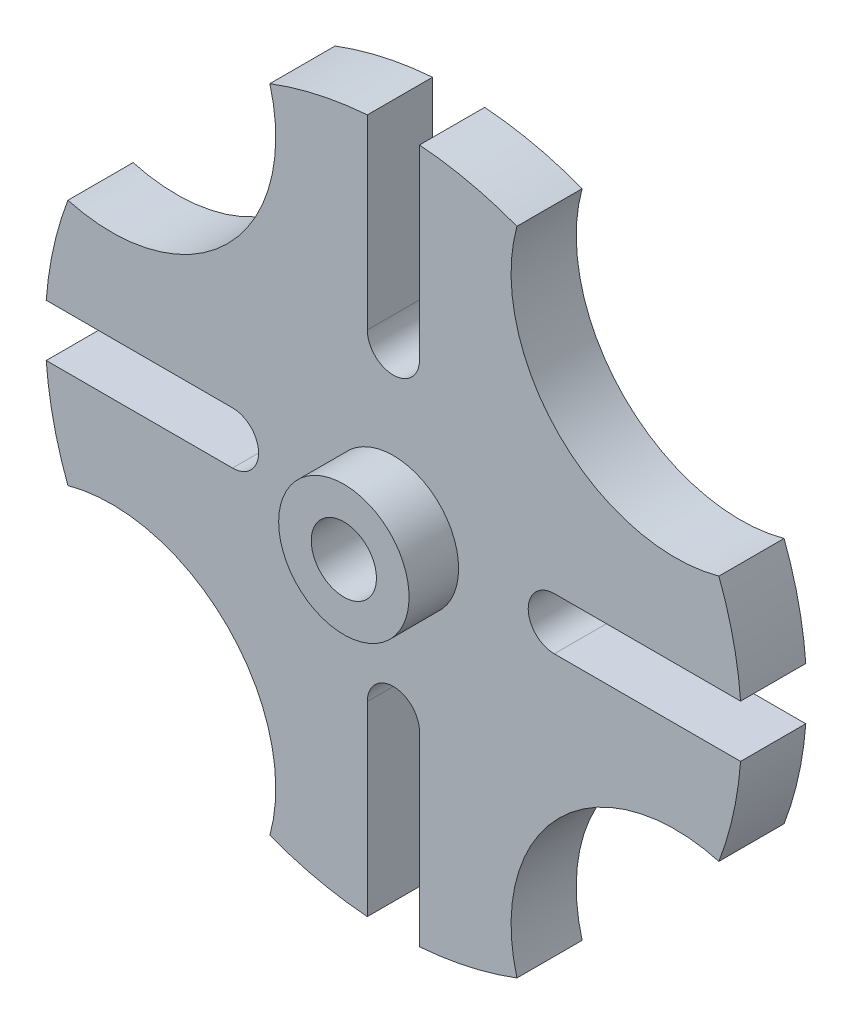
ISO-10303-21;
HEADER;
FILE_DESCRIPTION(('STEP AP214'),'2;1');
FILE_NAME('part.step','',(''),(''),'','','');
FILE_SCHEMA(('AUTOMOTIVE_DESIGN { 1 0 10303 214 1 1 1 1 }'));
ENDSEC;
DATA;
#1=APPLICATION_CONTEXT('core data for automotive mechanical design processes');
#2=APPLICATION_PROTOCOL_DEFINITION('international standard','automotive_design',2000,#1);
#3=PRODUCT_CONTEXT('',#1,'mechanical');
#4=PRODUCT('Part','Part','',(#3));
#5=PRODUCT_RELATED_PRODUCT_CATEGORY('part','',(#4));
#6=PRODUCT_DEFINITION_FORMATION('','',#4);
#7=PRODUCT_DEFINITION_CONTEXT('part definition',#1,'design');
#8=PRODUCT_DEFINITION('design','',#6,#7);
#9=PRODUCT_DEFINITION_SHAPE('','',#8);
#10=(LENGTH_UNIT() NAMED_UNIT(*) SI_UNIT(.MILLI.,.METRE.));
#11=(NAMED_UNIT(*) PLANE_ANGLE_UNIT() SI_UNIT($,.RADIAN.));
#12=(NAMED_UNIT(*) SI_UNIT($,.STERADIAN.) SOLID_ANGLE_UNIT());
#13=UNCERTAINTY_MEASURE_WITH_UNIT(LENGTH_MEASURE(1.E-05),#10,'distance_accuracy_value','');
#14=(GEOMETRIC_REPRESENTATION_CONTEXT(3) GLOBAL_UNCERTAINTY_ASSIGNED_CONTEXT((#13)) GLOBAL_UNIT_ASSIGNED_CONTEXT((#10,
#11,#12)) REPRESENTATION_CONTEXT('',''));
#15=CARTESIAN_POINT('',(0.,0.,0.));
#16=DIRECTION('',(0.,0.,1.));
#17=DIRECTION('',(1.,0.,0.));
#18=AXIS2_PLACEMENT_3D('',#15,#16,#17);
#19=CARTESIAN_POINT('',(27.4616232182294,27.4616232182295,6.35));
#20=DIRECTION('',(0.,0.,-1.));
#21=DIRECTION('',(-1.,0.,0.));
#22=AXIS2_PLACEMENT_3D('',#19,#20,#21);
#23=CYLINDRICAL_SURFACE('',#22,16.002);
#24=CARTESIAN_POINT('',(27.4616232182294,27.4616232182295,0.));
#25=DIRECTION('',(0.,0.,-1.));
#26=DIRECTION('',(1.,0.,0.));
#27=AXIS2_PLACEMENT_3D('',#24,#25,#26);
#28=CIRCLE('',#27,16.002);
#29=CARTESIAN_POINT('',(31.7026027149478,12.0318436699529,0.));
#30=VERTEX_POINT('',#29);
#31=CARTESIAN_POINT('',(12.0318436699528,31.7026027149478,0.));
#32=VERTEX_POINT('',#31);
#33=EDGE_CURVE('E238',#30,#32,#28,.T.);
#34=ORIENTED_EDGE('',*,*,#33,.T.);
#35=DIRECTION('',(0.,0.,-1.));
#36=VECTOR('',#35,1.);
#37=CARTESIAN_POINT('',(12.0318436699528,31.7026027149478,6.35));
#38=LINE('',#37,#36);
#39=CARTESIAN_POINT('',(12.0318436699528,31.7026027149478,6.35));
#40=VERTEX_POINT('',#39);
#41=EDGE_CURVE('E42',#40,#32,#38,.T.);
#42=ORIENTED_EDGE('',*,*,#41,.F.);
#43=CARTESIAN_POINT('',(27.4616232182294,27.4616232182295,6.35));
#44=DIRECTION('',(0.,0.,-1.));
#45=DIRECTION('',(1.,0.,0.));
#46=AXIS2_PLACEMENT_3D('',#43,#44,#45);
#47=CIRCLE('',#46,16.002);
#48=CARTESIAN_POINT('',(31.7026027149478,12.0318436699529,6.35));
#49=VERTEX_POINT('',#48);
#50=EDGE_CURVE('E309',#49,#40,#47,.T.);
#51=ORIENTED_EDGE('',*,*,#50,.F.);
#52=DIRECTION('',(0.,0.,-1.));
#53=VECTOR('',#52,1.);
#54=CARTESIAN_POINT('',(31.7026027149478,12.0318436699529,6.35));
#55=LINE('',#54,#53);
#56=EDGE_CURVE('E234',#49,#30,#55,.T.);
#57=ORIENTED_EDGE('',*,*,#56,.T.);
#58=EDGE_LOOP('',(#34,#42,#51,#57));
#59=FACE_BOUND('',#58,.T.);
#60=ADVANCED_FACE('F39',(#59),#23,.F.);
#61=CARTESIAN_POINT('',(0.,0.,6.35));
#62=DIRECTION('',(0.,0.,-1.));
#63=DIRECTION('',(-1.,0.,0.));
#64=AXIS2_PLACEMENT_3D('',#61,#62,#63);
#65=CYLINDRICAL_SURFACE('',#64,33.909);
#66=CARTESIAN_POINT('',(0.,0.,0.));
#67=DIRECTION('',(0.,0.,1.));
#68=DIRECTION('',(1.,0.,0.));
#69=AXIS2_PLACEMENT_3D('',#66,#67,#68);
#70=CIRCLE('',#69,33.909);
#71=CARTESIAN_POINT('',(2.53999999999999,33.8137350938934,0.));
#72=VERTEX_POINT('',#71);
#73=EDGE_CURVE('E242',#32,#72,#70,.T.);
#74=ORIENTED_EDGE('',*,*,#73,.T.);
#75=DIRECTION('',(0.,0.,-1.));
#76=VECTOR('',#75,1.);
#77=CARTESIAN_POINT('',(2.53999999999999,33.8137350938934,6.35));
#78=LINE('',#77,#76);
#79=CARTESIAN_POINT('',(2.53999999999999,33.8137350938934,6.35));
#80=VERTEX_POINT('',#79);
#81=EDGE_CURVE('E387',#80,#72,#78,.T.);
#82=ORIENTED_EDGE('',*,*,#81,.F.);
#83=CARTESIAN_POINT('',(0.,0.,6.35));
#84=DIRECTION('',(0.,0.,1.));
#85=DIRECTION('',(1.,0.,0.));
#86=AXIS2_PLACEMENT_3D('',#83,#84,#85);
#87=CIRCLE('',#86,33.909);
#88=EDGE_CURVE('E149',#40,#80,#87,.T.);
#89=ORIENTED_EDGE('',*,*,#88,.F.);
#90=ORIENTED_EDGE('',*,*,#41,.T.);
#91=EDGE_LOOP('',(#74,#82,#89,#90));
#92=FACE_BOUND('',#91,.T.);
#93=ADVANCED_FACE('F395',(#92),#65,.T.);
#94=CARTESIAN_POINT('',(2.54,15.6704826026514,6.35));
#95=DIRECTION('',(1.,0.,0.));
#96=DIRECTION('',(0.,1.,0.));
#97=AXIS2_PLACEMENT_3D('',#94,#95,#96);
#98=PLANE('',#97);
#99=DIRECTION('',(0.,-1.,0.));
#100=VECTOR('',#99,1.);
#101=CARTESIAN_POINT('',(2.54,15.6704826026514,0.));
#102=LINE('',#101,#100);
#103=CARTESIAN_POINT('',(2.54000000000001,15.6704826026514,0.));
#104=VERTEX_POINT('',#103);
#105=EDGE_CURVE('E246',#72,#104,#102,.T.);
#106=ORIENTED_EDGE('',*,*,#105,.T.);
#107=DIRECTION('',(0.,0.,-1.));
#108=VECTOR('',#107,1.);
#109=CARTESIAN_POINT('',(2.54000000000001,15.6704826026514,6.35));
#110=LINE('',#109,#108);
#111=CARTESIAN_POINT('',(2.54000000000001,15.6704826026514,6.35));
#112=VERTEX_POINT('',#111);
#113=EDGE_CURVE('E384',#112,#104,#110,.T.);
#114=ORIENTED_EDGE('',*,*,#113,.F.);
#115=DIRECTION('',(0.,-1.,0.));
#116=VECTOR('',#115,1.);
#117=CARTESIAN_POINT('',(2.54,15.6704826026514,6.35));
#118=LINE('',#117,#116);
#119=EDGE_CURVE('E413',#80,#112,#118,.T.);
#120=ORIENTED_EDGE('',*,*,#119,.F.);
#121=ORIENTED_EDGE('',*,*,#81,.T.);
#122=EDGE_LOOP('',(#106,#114,#120,#121));
#123=FACE_BOUND('',#122,.T.);
#124=ADVANCED_FACE('F404',(#123),#98,.F.);
#125=CARTESIAN_POINT('',(0.,15.6704826026514,6.35));
#126=DIRECTION('',(0.,0.,-1.));
#127=DIRECTION('',(-1.,0.,0.));
#128=AXIS2_PLACEMENT_3D('',#125,#126,#127);
#129=CYLINDRICAL_SURFACE('',#128,2.54);
#130=CARTESIAN_POINT('',(0.,15.6704826026514,0.));
#131=DIRECTION('',(0.,0.,-1.));
#132=DIRECTION('',(1.,0.,0.));
#133=AXIS2_PLACEMENT_3D('',#130,#131,#132);
#134=CIRCLE('',#133,2.54);
#135=CARTESIAN_POINT('',(-2.54,15.6704826026514,0.));
#136=VERTEX_POINT('',#135);
#137=EDGE_CURVE('E249',#104,#136,#134,.T.);
#138=ORIENTED_EDGE('',*,*,#137,.T.);
#139=DIRECTION('',(0.,0.,-1.));
#140=VECTOR('',#139,1.);
#141=CARTESIAN_POINT('',(-2.54,15.6704826026514,6.35));
#142=LINE('',#141,#140);
#143=CARTESIAN_POINT('',(-2.54,15.6704826026514,6.35));
#144=VERTEX_POINT('',#143);
#145=EDGE_CURVE('E380',#144,#136,#142,.T.);
#146=ORIENTED_EDGE('',*,*,#145,.F.);
#147=CARTESIAN_POINT('',(0.,15.6704826026514,6.35));
#148=DIRECTION('',(0.,0.,-1.));
#149=DIRECTION('',(1.,0.,0.));
#150=AXIS2_PLACEMENT_3D('',#147,#148,#149);
#151=CIRCLE('',#150,2.54);
#152=EDGE_CURVE('E409',#112,#144,#151,.T.);
#153=ORIENTED_EDGE('',*,*,#152,.F.);
#154=ORIENTED_EDGE('',*,*,#113,.T.);
#155=EDGE_LOOP('',(#138,#146,#153,#154));
#156=FACE_BOUND('',#155,.T.);
#157=ADVANCED_FACE('F407',(#156),#129,.F.);
#158=CARTESIAN_POINT('',(-2.54,15.6704826026514,6.35));
#159=DIRECTION('',(-1.,0.,0.));
#160=DIRECTION('',(0.,-1.,0.));
#161=AXIS2_PLACEMENT_3D('',#158,#159,#160);
#162=PLANE('',#161);
#163=DIRECTION('',(0.,1.,0.));
#164=VECTOR('',#163,1.);
#165=CARTESIAN_POINT('',(-2.54,15.6704826026514,0.));
#166=LINE('',#165,#164);
#167=CARTESIAN_POINT('',(-2.54000000000001,33.8137350938934,0.));
#168=VERTEX_POINT('',#167);
#169=EDGE_CURVE('E252',#136,#168,#166,.T.);
#170=ORIENTED_EDGE('',*,*,#169,.T.);
#171=DIRECTION('',(0.,0.,-1.));
#172=VECTOR('',#171,1.);
#173=CARTESIAN_POINT('',(-2.54000000000001,33.8137350938934,6.35));
#174=LINE('',#173,#172);
#175=CARTESIAN_POINT('',(-2.54000000000001,33.8137350938934,6.35));
#176=VERTEX_POINT('',#175);
#177=EDGE_CURVE('E376',#176,#168,#174,.T.);
#178=ORIENTED_EDGE('',*,*,#177,.F.);
#179=DIRECTION('',(0.,1.,0.));
#180=VECTOR('',#179,1.);
#181=CARTESIAN_POINT('',(-2.54,15.6704826026514,6.35));
#182=LINE('',#181,#180);
#183=EDGE_CURVE('E412',#144,#176,#182,.T.);
#184=ORIENTED_EDGE('',*,*,#183,.F.);
#185=ORIENTED_EDGE('',*,*,#145,.T.);
#186=EDGE_LOOP('',(#170,#178,#184,#185));
#187=FACE_BOUND('',#186,.T.);
#188=ADVANCED_FACE('F546',(#187),#162,.F.);
#189=CARTESIAN_POINT('',(0.,0.,6.35));
#190=DIRECTION('',(0.,0.,-1.));
#191=DIRECTION('',(-1.,0.,0.));
#192=AXIS2_PLACEMENT_3D('',#189,#190,#191);
#193=CYLINDRICAL_SURFACE('',#192,33.909);
#194=CARTESIAN_POINT('',(0.,0.,0.));
#195=DIRECTION('',(0.,0.,1.));
#196=DIRECTION('',(1.,0.,0.));
#197=AXIS2_PLACEMENT_3D('',#194,#195,#196);
#198=CIRCLE('',#197,33.909);
#199=CARTESIAN_POINT('',(-12.0318436699529,31.7026027149478,0.));
#200=VERTEX_POINT('',#199);
#201=EDGE_CURVE('E255',#168,#200,#198,.T.);
#202=ORIENTED_EDGE('',*,*,#201,.T.);
#203=DIRECTION('',(0.,0.,-1.));
#204=VECTOR('',#203,1.);
#205=CARTESIAN_POINT('',(-12.0318436699529,31.7026027149478,6.35));
#206=LINE('',#205,#204);
#207=CARTESIAN_POINT('',(-12.0318436699529,31.7026027149478,6.35));
#208=VERTEX_POINT('',#207);
#209=EDGE_CURVE('E372',#208,#200,#206,.T.);
#210=ORIENTED_EDGE('',*,*,#209,.F.);
#211=CARTESIAN_POINT('',(0.,0.,6.35));
#212=DIRECTION('',(0.,0.,1.));
#213=DIRECTION('',(1.,0.,0.));
#214=AXIS2_PLACEMENT_3D('',#211,#212,#213);
#215=CIRCLE('',#214,33.909);
#216=EDGE_CURVE('E417',#176,#208,#215,.T.);
#217=ORIENTED_EDGE('',*,*,#216,.F.);
#218=ORIENTED_EDGE('',*,*,#177,.T.);
#219=EDGE_LOOP('',(#202,#210,#217,#218));
#220=FACE_BOUND('',#219,.T.);
#221=ADVANCED_FACE('F543',(#220),#193,.T.);
#222=CARTESIAN_POINT('',(-27.4616232182295,27.4616232182294,6.35));
#223=DIRECTION('',(0.,0.,-1.));
#224=DIRECTION('',(-1.,0.,0.));
#225=AXIS2_PLACEMENT_3D('',#222,#223,#224);
#226=CYLINDRICAL_SURFACE('',#225,16.002);
#227=CARTESIAN_POINT('',(-27.4616232182295,27.4616232182294,0.));
#228=DIRECTION('',(0.,0.,-1.));
#229=DIRECTION('',(1.,0.,0.));
#230=AXIS2_PLACEMENT_3D('',#227,#228,#229);
#231=CIRCLE('',#230,16.002);
#232=CARTESIAN_POINT('',(-31.7026027149478,12.0318436699528,0.));
#233=VERTEX_POINT('',#232);
#234=EDGE_CURVE('E258',#200,#233,#231,.T.);
#235=ORIENTED_EDGE('',*,*,#234,.T.);
#236=DIRECTION('',(0.,0.,-1.));
#237=VECTOR('',#236,1.);
#238=CARTESIAN_POINT('',(-31.7026027149478,12.0318436699528,6.35));
#239=LINE('',#238,#237);
#240=CARTESIAN_POINT('',(-31.7026027149478,12.0318436699528,6.35));
#241=VERTEX_POINT('',#240);
#242=EDGE_CURVE('E368',#241,#233,#239,.T.);
#243=ORIENTED_EDGE('',*,*,#242,.F.);
#244=CARTESIAN_POINT('',(-27.4616232182295,27.4616232182294,6.35));
#245=DIRECTION('',(0.,0.,-1.));
#246=DIRECTION('',(1.,0.,0.));
#247=AXIS2_PLACEMENT_3D('',#244,#245,#246);
#248=CIRCLE('',#247,16.002);
#249=EDGE_CURVE('E424',#208,#241,#248,.T.);
#250=ORIENTED_EDGE('',*,*,#249,.F.);
#251=ORIENTED_EDGE('',*,*,#209,.T.);
#252=EDGE_LOOP('',(#235,#243,#250,#251));
#253=FACE_BOUND('',#252,.T.);
#254=ADVANCED_FACE('F538',(#253),#226,.F.);
#255=CARTESIAN_POINT('',(0.,0.,6.35));
#256=DIRECTION('',(0.,0.,-1.));
#257=DIRECTION('',(-1.,0.,0.));
#258=AXIS2_PLACEMENT_3D('',#255,#256,#257);
#259=CYLINDRICAL_SURFACE('',#258,33.909);
#260=CARTESIAN_POINT('',(0.,0.,0.));
#261=DIRECTION('',(0.,0.,1.));
#262=DIRECTION('',(1.,0.,0.));
#263=AXIS2_PLACEMENT_3D('',#260,#261,#262);
#264=CIRCLE('',#263,33.909);
#265=CARTESIAN_POINT('',(-33.8137350938934,2.54,0.));
#266=VERTEX_POINT('',#265);
#267=EDGE_CURVE('E261',#233,#266,#264,.T.);
#268=ORIENTED_EDGE('',*,*,#267,.T.);
#269=DIRECTION('',(0.,0.,-1.));
#270=VECTOR('',#269,1.);
#271=CARTESIAN_POINT('',(-33.8137350938934,2.54,6.35));
#272=LINE('',#271,#270);
#273=CARTESIAN_POINT('',(-33.8137350938934,2.54,6.35));
#274=VERTEX_POINT('',#273);
#275=EDGE_CURVE('E364',#274,#266,#272,.T.);
#276=ORIENTED_EDGE('',*,*,#275,.F.);
#277=CARTESIAN_POINT('',(0.,0.,6.35));
#278=DIRECTION('',(0.,0.,1.));
#279=DIRECTION('',(1.,0.,0.));
#280=AXIS2_PLACEMENT_3D('',#277,#278,#279);
#281=CIRCLE('',#280,33.909);
#282=EDGE_CURVE('E427',#241,#274,#281,.T.);
#283=ORIENTED_EDGE('',*,*,#282,.F.);
#284=ORIENTED_EDGE('',*,*,#242,.T.);
#285=EDGE_LOOP('',(#268,#276,#283,#284));
#286=FACE_BOUND('',#285,.T.);
#287=ADVANCED_FACE('F533',(#286),#259,.T.);
#288=CARTESIAN_POINT('',(-15.6704826026514,2.54000000000001,6.35));
#289=DIRECTION('',(0.,1.,0.));
#290=DIRECTION('',(-1.,0.,0.));
#291=AXIS2_PLACEMENT_3D('',#288,#289,#290);
#292=PLANE('',#291);
#293=DIRECTION('',(1.,0.,0.));
#294=VECTOR('',#293,1.);
#295=CARTESIAN_POINT('',(-15.6704826026514,2.54000000000001,0.));
#296=LINE('',#295,#294);
#297=CARTESIAN_POINT('',(-15.6704826026514,2.54,0.));
#298=VERTEX_POINT('',#297);
#299=EDGE_CURVE('E264',#266,#298,#296,.T.);
#300=ORIENTED_EDGE('',*,*,#299,.T.);
#301=DIRECTION('',(0.,0.,-1.));
#302=VECTOR('',#301,1.);
#303=CARTESIAN_POINT('',(-15.6704826026514,2.54,6.35));
#304=LINE('',#303,#302);
#305=CARTESIAN_POINT('',(-15.6704826026514,2.54,6.35));
#306=VERTEX_POINT('',#305);
#307=EDGE_CURVE('E360',#306,#298,#304,.T.);
#308=ORIENTED_EDGE('',*,*,#307,.F.);
#309=DIRECTION('',(1.,0.,0.));
#310=VECTOR('',#309,1.);
#311=CARTESIAN_POINT('',(-15.6704826026514,2.54000000000001,6.35));
#312=LINE('',#311,#310);
#313=EDGE_CURVE('E430',#274,#306,#312,.T.);
#314=ORIENTED_EDGE('',*,*,#313,.F.);
#315=ORIENTED_EDGE('',*,*,#275,.T.);
#316=EDGE_LOOP('',(#300,#308,#314,#315));
#317=FACE_BOUND('',#316,.T.);
#318=ADVANCED_FACE('F529',(#317),#292,.F.);
#319=CARTESIAN_POINT('',(-15.6704826026514,0.,6.35));
#320=DIRECTION('',(0.,0.,-1.));
#321=DIRECTION('',(-1.,0.,0.));
#322=AXIS2_PLACEMENT_3D('',#319,#320,#321);
#323=CYLINDRICAL_SURFACE('',#322,2.54);
#324=CARTESIAN_POINT('',(-15.6704826026514,0.,0.));
#325=DIRECTION('',(0.,0.,-1.));
#326=DIRECTION('',(1.,0.,0.));
#327=AXIS2_PLACEMENT_3D('',#324,#325,#326);
#328=CIRCLE('',#327,2.54);
#329=CARTESIAN_POINT('',(-15.6704826026514,-2.53999999999999,0.));
#330=VERTEX_POINT('',#329);
#331=EDGE_CURVE('E267',#298,#330,#328,.T.);
#332=ORIENTED_EDGE('',*,*,#331,.T.);
#333=DIRECTION('',(0.,0.,-1.));
#334=VECTOR('',#333,1.);
#335=CARTESIAN_POINT('',(-15.6704826026514,-2.53999999999999,6.35));
#336=LINE('',#335,#334);
#337=CARTESIAN_POINT('',(-15.6704826026514,-2.53999999999999,6.35));
#338=VERTEX_POINT('',#337);
#339=EDGE_CURVE('E356',#338,#330,#336,.T.);
#340=ORIENTED_EDGE('',*,*,#339,.F.);
#341=CARTESIAN_POINT('',(-15.6704826026514,0.,6.35));
#342=DIRECTION('',(0.,0.,-1.));
#343=DIRECTION('',(1.,0.,0.));
#344=AXIS2_PLACEMENT_3D('',#341,#342,#343);
#345=CIRCLE('',#344,2.54);
#346=EDGE_CURVE('E433',#306,#338,#345,.T.);
#347=ORIENTED_EDGE('',*,*,#346,.F.);
#348=ORIENTED_EDGE('',*,*,#307,.T.);
#349=EDGE_LOOP('',(#332,#340,#347,#348));
#350=FACE_BOUND('',#349,.T.);
#351=ADVANCED_FACE('F524',(#350),#323,.F.);
#352=CARTESIAN_POINT('',(-15.6704826026514,-2.53999999999999,6.35));
#353=DIRECTION('',(0.,-1.,0.));
#354=DIRECTION('',(1.,0.,0.));
#355=AXIS2_PLACEMENT_3D('',#352,#353,#354);
#356=PLANE('',#355);
#357=DIRECTION('',(-1.,0.,0.));
#358=VECTOR('',#357,1.);
#359=CARTESIAN_POINT('',(-15.6704826026514,-2.53999999999999,0.));
#360=LINE('',#359,#358);
#361=CARTESIAN_POINT('',(-33.8137350938934,-2.54,0.));
#362=VERTEX_POINT('',#361);
#363=EDGE_CURVE('E270',#330,#362,#360,.T.);
#364=ORIENTED_EDGE('',*,*,#363,.T.);
#365=DIRECTION('',(0.,0.,-1.));
#366=VECTOR('',#365,1.);
#367=CARTESIAN_POINT('',(-33.8137350938934,-2.54,6.35));
#368=LINE('',#367,#366);
#369=CARTESIAN_POINT('',(-33.8137350938934,-2.54,6.35));
#370=VERTEX_POINT('',#369);
#371=EDGE_CURVE('E352',#370,#362,#368,.T.);
#372=ORIENTED_EDGE('',*,*,#371,.F.);
#373=DIRECTION('',(-1.,0.,0.));
#374=VECTOR('',#373,1.);
#375=CARTESIAN_POINT('',(-15.6704826026514,-2.53999999999999,6.35));
#376=LINE('',#375,#374);
#377=EDGE_CURVE('E436',#338,#370,#376,.T.);
#378=ORIENTED_EDGE('',*,*,#377,.F.);
#379=ORIENTED_EDGE('',*,*,#339,.T.);
#380=EDGE_LOOP('',(#364,#372,#378,#379));
#381=FACE_BOUND('',#380,.T.);
#382=ADVANCED_FACE('F518',(#381),#356,.F.);
#383=CARTESIAN_POINT('',(0.,0.,6.35));
#384=DIRECTION('',(0.,0.,-1.));
#385=DIRECTION('',(-1.,0.,0.));
#386=AXIS2_PLACEMENT_3D('',#383,#384,#385);
#387=CYLINDRICAL_SURFACE('',#386,33.909);
#388=CARTESIAN_POINT('',(0.,0.,0.));
#389=DIRECTION('',(0.,0.,1.));
#390=DIRECTION('',(1.,0.,0.));
#391=AXIS2_PLACEMENT_3D('',#388,#389,#390);
#392=CIRCLE('',#391,33.909);
#393=CARTESIAN_POINT('',(-31.7026027149478,-12.0318436699529,0.));
#394=VERTEX_POINT('',#393);
#395=EDGE_CURVE('E273',#362,#394,#392,.T.);
#396=ORIENTED_EDGE('',*,*,#395,.T.);
#397=DIRECTION('',(0.,0.,-1.));
#398=VECTOR('',#397,1.);
#399=CARTESIAN_POINT('',(-31.7026027149478,-12.0318436699529,6.35));
#400=LINE('',#399,#398);
#401=CARTESIAN_POINT('',(-31.7026027149478,-12.0318436699529,6.35));
#402=VERTEX_POINT('',#401);
#403=EDGE_CURVE('E348',#402,#394,#400,.T.);
#404=ORIENTED_EDGE('',*,*,#403,.F.);
#405=CARTESIAN_POINT('',(0.,0.,6.35));
#406=DIRECTION('',(0.,0.,1.));
#407=DIRECTION('',(1.,0.,0.));
#408=AXIS2_PLACEMENT_3D('',#405,#406,#407);
#409=CIRCLE('',#408,33.909);
#410=EDGE_CURVE('E439',#370,#402,#409,.T.);
#411=ORIENTED_EDGE('',*,*,#410,.F.);
#412=ORIENTED_EDGE('',*,*,#371,.T.);
#413=EDGE_LOOP('',(#396,#404,#411,#412));
#414=FACE_BOUND('',#413,.T.);
#415=ADVANCED_FACE('F514',(#414),#387,.T.);
#416=CARTESIAN_POINT('',(-27.4616232182294,-27.4616232182295,6.35));
#417=DIRECTION('',(0.,0.,-1.));
#418=DIRECTION('',(-1.,0.,0.));
#419=AXIS2_PLACEMENT_3D('',#416,#417,#418);
#420=CYLINDRICAL_SURFACE('',#419,16.002);
#421=CARTESIAN_POINT('',(-27.4616232182294,-27.4616232182295,0.));
#422=DIRECTION('',(0.,0.,-1.));
#423=DIRECTION('',(1.,0.,0.));
#424=AXIS2_PLACEMENT_3D('',#421,#422,#423);
#425=CIRCLE('',#424,16.002);
#426=CARTESIAN_POINT('',(-12.0318436699528,-31.7026027149478,0.));
#427=VERTEX_POINT('',#426);
#428=EDGE_CURVE('E276',#394,#427,#425,.T.);
#429=ORIENTED_EDGE('',*,*,#428,.T.);
#430=DIRECTION('',(0.,0.,-1.));
#431=VECTOR('',#430,1.);
#432=CARTESIAN_POINT('',(-12.0318436699528,-31.7026027149478,6.35));
#433=LINE('',#432,#431);
#434=CARTESIAN_POINT('',(-12.0318436699528,-31.7026027149478,6.35));
#435=VERTEX_POINT('',#434);
#436=EDGE_CURVE('E344',#435,#427,#433,.T.);
#437=ORIENTED_EDGE('',*,*,#436,.F.);
#438=CARTESIAN_POINT('',(-27.4616232182294,-27.4616232182295,6.35));
#439=DIRECTION('',(0.,0.,-1.));
#440=DIRECTION('',(1.,0.,0.));
#441=AXIS2_PLACEMENT_3D('',#438,#439,#440);
#442=CIRCLE('',#441,16.002);
#443=EDGE_CURVE('E442',#402,#435,#442,.T.);
#444=ORIENTED_EDGE('',*,*,#443,.F.);
#445=ORIENTED_EDGE('',*,*,#403,.T.);
#446=EDGE_LOOP('',(#429,#437,#444,#445));
#447=FACE_BOUND('',#446,.T.);
#448=ADVANCED_FACE('F509',(#447),#420,.F.);
#449=CARTESIAN_POINT('',(0.,0.,6.35));
#450=DIRECTION('',(0.,0.,-1.));
#451=DIRECTION('',(-1.,0.,0.));
#452=AXIS2_PLACEMENT_3D('',#449,#450,#451);
#453=CYLINDRICAL_SURFACE('',#452,33.909);
#454=CARTESIAN_POINT('',(0.,0.,0.));
#455=DIRECTION('',(0.,0.,1.));
#456=DIRECTION('',(1.,0.,0.));
#457=AXIS2_PLACEMENT_3D('',#454,#455,#456);
#458=CIRCLE('',#457,33.909);
#459=CARTESIAN_POINT('',(-2.54,-33.8137350938934,0.));
#460=VERTEX_POINT('',#459);
#461=EDGE_CURVE('E279',#427,#460,#458,.T.);
#462=ORIENTED_EDGE('',*,*,#461,.T.);
#463=DIRECTION('',(0.,0.,-1.));
#464=VECTOR('',#463,1.);
#465=CARTESIAN_POINT('',(-2.54,-33.8137350938934,6.35));
#466=LINE('',#465,#464);
#467=CARTESIAN_POINT('',(-2.54,-33.8137350938934,6.35));
#468=VERTEX_POINT('',#467);
#469=EDGE_CURVE('E340',#468,#460,#466,.T.);
#470=ORIENTED_EDGE('',*,*,#469,.F.);
#471=CARTESIAN_POINT('',(0.,0.,6.35));
#472=DIRECTION('',(0.,0.,1.));
#473=DIRECTION('',(1.,0.,0.));
#474=AXIS2_PLACEMENT_3D('',#471,#472,#473);
#475=CIRCLE('',#474,33.909);
#476=EDGE_CURVE('E445',#435,#468,#475,.T.);
#477=ORIENTED_EDGE('',*,*,#476,.F.);
#478=ORIENTED_EDGE('',*,*,#436,.T.);
#479=EDGE_LOOP('',(#462,#470,#477,#478));
#480=FACE_BOUND('',#479,.T.);
#481=ADVANCED_FACE('F503',(#480),#453,.T.);
#482=CARTESIAN_POINT('',(-2.54,-15.6704826026514,6.35));
#483=DIRECTION('',(-1.,0.,0.));
#484=DIRECTION('',(0.,-1.,0.));
#485=AXIS2_PLACEMENT_3D('',#482,#483,#484);
#486=PLANE('',#485);
#487=DIRECTION('',(0.,1.,0.));
#488=VECTOR('',#487,1.);
#489=CARTESIAN_POINT('',(-2.54,-15.6704826026514,0.));
#490=LINE('',#489,#488);
#491=CARTESIAN_POINT('',(-2.54000000000001,-15.6704826026514,0.));
#492=VERTEX_POINT('',#491);
#493=EDGE_CURVE('E282',#460,#492,#490,.T.);
#494=ORIENTED_EDGE('',*,*,#493,.T.);
#495=DIRECTION('',(0.,0.,-1.));
#496=VECTOR('',#495,1.);
#497=CARTESIAN_POINT('',(-2.54000000000001,-15.6704826026514,6.35));
#498=LINE('',#497,#496);
#499=CARTESIAN_POINT('',(-2.54000000000001,-15.6704826026514,6.35));
#500=VERTEX_POINT('',#499);
#501=EDGE_CURVE('E336',#500,#492,#498,.T.);
#502=ORIENTED_EDGE('',*,*,#501,.F.);
#503=DIRECTION('',(0.,1.,0.));
#504=VECTOR('',#503,1.);
#505=CARTESIAN_POINT('',(-2.54,-15.6704826026514,6.35));
#506=LINE('',#505,#504);
#507=EDGE_CURVE('E448',#468,#500,#506,.T.);
#508=ORIENTED_EDGE('',*,*,#507,.F.);
#509=ORIENTED_EDGE('',*,*,#469,.T.);
#510=EDGE_LOOP('',(#494,#502,#508,#509));
#511=FACE_BOUND('',#510,.T.);
#512=ADVANCED_FACE('F499',(#511),#486,.F.);
#513=CARTESIAN_POINT('',(0.,-15.6704826026514,6.35));
#514=DIRECTION('',(0.,0.,-1.));
#515=DIRECTION('',(-1.,0.,0.));
#516=AXIS2_PLACEMENT_3D('',#513,#514,#515);
#517=CYLINDRICAL_SURFACE('',#516,2.54000000000001);
#518=CARTESIAN_POINT('',(0.,-15.6704826026514,0.));
#519=DIRECTION('',(0.,0.,-1.));
#520=DIRECTION('',(1.,0.,0.));
#521=AXIS2_PLACEMENT_3D('',#518,#519,#520);
#522=CIRCLE('',#521,2.54000000000001);
#523=CARTESIAN_POINT('',(2.54000000000001,-15.6704826026514,0.));
#524=VERTEX_POINT('',#523);
#525=EDGE_CURVE('E285',#492,#524,#522,.T.);
#526=ORIENTED_EDGE('',*,*,#525,.T.);
#527=DIRECTION('',(0.,0.,-1.));
#528=VECTOR('',#527,1.);
#529=CARTESIAN_POINT('',(2.54000000000001,-15.6704826026514,6.35));
#530=LINE('',#529,#528);
#531=CARTESIAN_POINT('',(2.54000000000001,-15.6704826026514,6.35));
#532=VERTEX_POINT('',#531);
#533=EDGE_CURVE('E332',#532,#524,#530,.T.);
#534=ORIENTED_EDGE('',*,*,#533,.F.);
#535=CARTESIAN_POINT('',(0.,-15.6704826026514,6.35));
#536=DIRECTION('',(0.,0.,-1.));
#537=DIRECTION('',(1.,0.,0.));
#538=AXIS2_PLACEMENT_3D('',#535,#536,#537);
#539=CIRCLE('',#538,2.54000000000001);
#540=EDGE_CURVE('E451',#500,#532,#539,.T.);
#541=ORIENTED_EDGE('',*,*,#540,.F.);
#542=ORIENTED_EDGE('',*,*,#501,.T.);
#543=EDGE_LOOP('',(#526,#534,#541,#542));
#544=FACE_BOUND('',#543,.T.);
#545=ADVANCED_FACE('F494',(#544),#517,.F.);
#546=CARTESIAN_POINT('',(2.54000000000001,-15.6704826026514,6.35));
#547=DIRECTION('',(1.,0.,0.));
#548=DIRECTION('',(0.,1.,0.));
#549=AXIS2_PLACEMENT_3D('',#546,#547,#548);
#550=PLANE('',#549);
#551=DIRECTION('',(0.,-1.,0.));
#552=VECTOR('',#551,1.);
#553=CARTESIAN_POINT('',(2.54000000000001,-15.6704826026514,0.));
#554=LINE('',#553,#552);
#555=CARTESIAN_POINT('',(2.54,-33.8137350938934,0.));
#556=VERTEX_POINT('',#555);
#557=EDGE_CURVE('E288',#524,#556,#554,.T.);
#558=ORIENTED_EDGE('',*,*,#557,.T.);
#559=DIRECTION('',(0.,0.,-1.));
#560=VECTOR('',#559,1.);
#561=CARTESIAN_POINT('',(2.54,-33.8137350938934,6.35));
#562=LINE('',#561,#560);
#563=CARTESIAN_POINT('',(2.54,-33.8137350938934,6.35));
#564=VERTEX_POINT('',#563);
#565=EDGE_CURVE('E328',#564,#556,#562,.T.);
#566=ORIENTED_EDGE('',*,*,#565,.F.);
#567=DIRECTION('',(0.,-1.,0.));
#568=VECTOR('',#567,1.);
#569=CARTESIAN_POINT('',(2.54000000000001,-15.6704826026514,6.35));
#570=LINE('',#569,#568);
#571=EDGE_CURVE('E454',#532,#564,#570,.T.);
#572=ORIENTED_EDGE('',*,*,#571,.F.);
#573=ORIENTED_EDGE('',*,*,#533,.T.);
#574=EDGE_LOOP('',(#558,#566,#572,#573));
#575=FACE_BOUND('',#574,.T.);
#576=ADVANCED_FACE('F488',(#575),#550,.F.);
#577=CARTESIAN_POINT('',(0.,0.,6.35));
#578=DIRECTION('',(0.,0.,-1.));
#579=DIRECTION('',(-1.,0.,0.));
#580=AXIS2_PLACEMENT_3D('',#577,#578,#579);
#581=CYLINDRICAL_SURFACE('',#580,33.909);
#582=CARTESIAN_POINT('',(0.,0.,0.));
#583=DIRECTION('',(0.,0.,1.));
#584=DIRECTION('',(1.,0.,0.));
#585=AXIS2_PLACEMENT_3D('',#582,#583,#584);
#586=CIRCLE('',#585,33.909);
#587=CARTESIAN_POINT('',(12.0318436699532,-31.7026027149477,0.));
#588=VERTEX_POINT('',#587);
#589=EDGE_CURVE('E291',#556,#588,#586,.T.);
#590=ORIENTED_EDGE('',*,*,#589,.T.);
#591=DIRECTION('',(0.,0.,-1.));
#592=VECTOR('',#591,1.);
#593=CARTESIAN_POINT('',(12.0318436699532,-31.7026027149477,6.35));
#594=LINE('',#593,#592);
#595=CARTESIAN_POINT('',(12.0318436699532,-31.7026027149477,6.35));
#596=VERTEX_POINT('',#595);
#597=EDGE_CURVE('E324',#596,#588,#594,.T.);
#598=ORIENTED_EDGE('',*,*,#597,.F.);
#599=CARTESIAN_POINT('',(0.,0.,6.35));
#600=DIRECTION('',(0.,0.,1.));
#601=DIRECTION('',(1.,0.,0.));
#602=AXIS2_PLACEMENT_3D('',#599,#600,#601);
#603=CIRCLE('',#602,33.909);
#604=EDGE_CURVE('E457',#564,#596,#603,.T.);
#605=ORIENTED_EDGE('',*,*,#604,.F.);
#606=ORIENTED_EDGE('',*,*,#565,.T.);
#607=EDGE_LOOP('',(#590,#598,#605,#606));
#608=FACE_BOUND('',#607,.T.);
#609=ADVANCED_FACE('F484',(#608),#581,.T.);
#610=CARTESIAN_POINT('',(27.4616232182302,-27.46162321823,6.35));
#611=DIRECTION('',(0.,0.,-1.));
#612=DIRECTION('',(-1.,0.,0.));
#613=AXIS2_PLACEMENT_3D('',#610,#611,#612);
#614=CYLINDRICAL_SURFACE('',#613,16.0020000000003);
#615=CARTESIAN_POINT('',(27.4616232182302,-27.46162321823,0.));
#616=DIRECTION('',(0.,0.,-1.));
#617=DIRECTION('',(1.,0.,0.));
#618=AXIS2_PLACEMENT_3D('',#615,#616,#617);
#619=CIRCLE('',#618,16.0020000000003);
#620=CARTESIAN_POINT('',(31.7026027149482,-12.0318436699532,0.));
#621=VERTEX_POINT('',#620);
#622=EDGE_CURVE('E294',#588,#621,#619,.T.);
#623=ORIENTED_EDGE('',*,*,#622,.T.);
#624=DIRECTION('',(0.,0.,-1.));
#625=VECTOR('',#624,1.);
#626=CARTESIAN_POINT('',(31.7026027149482,-12.0318436699532,6.35));
#627=LINE('',#626,#625);
#628=CARTESIAN_POINT('',(31.7026027149482,-12.0318436699532,6.35));
#629=VERTEX_POINT('',#628);
#630=EDGE_CURVE('E320',#629,#621,#627,.T.);
#631=ORIENTED_EDGE('',*,*,#630,.F.);
#632=CARTESIAN_POINT('',(27.4616232182302,-27.46162321823,6.35));
#633=DIRECTION('',(0.,0.,-1.));
#634=DIRECTION('',(1.,0.,0.));
#635=AXIS2_PLACEMENT_3D('',#632,#633,#634);
#636=CIRCLE('',#635,16.0020000000003);
#637=EDGE_CURVE('E460',#596,#629,#636,.T.);
#638=ORIENTED_EDGE('',*,*,#637,.F.);
#639=ORIENTED_EDGE('',*,*,#597,.T.);
#640=EDGE_LOOP('',(#623,#631,#638,#639));
#641=FACE_BOUND('',#640,.T.);
#642=ADVANCED_FACE('F480',(#641),#614,.F.);
#643=CARTESIAN_POINT('',(0.,0.,6.35));
#644=DIRECTION('',(0.,0.,-1.));
#645=DIRECTION('',(-1.,0.,0.));
#646=AXIS2_PLACEMENT_3D('',#643,#644,#645);
#647=CYLINDRICAL_SURFACE('',#646,33.9090000000005);
#648=CARTESIAN_POINT('',(0.,0.,0.));
#649=DIRECTION('',(0.,0.,1.));
#650=DIRECTION('',(1.,0.,0.));
#651=AXIS2_PLACEMENT_3D('',#648,#649,#650);
#652=CIRCLE('',#651,33.9090000000005);
#653=CARTESIAN_POINT('',(33.8137350938934,-2.54,0.));
#654=VERTEX_POINT('',#653);
#655=EDGE_CURVE('E297',#621,#654,#652,.T.);
#656=ORIENTED_EDGE('',*,*,#655,.T.);
#657=DIRECTION('',(0.,0.,-1.));
#658=VECTOR('',#657,1.);
#659=CARTESIAN_POINT('',(33.8137350938934,-2.54,6.35));
#660=LINE('',#659,#658);
#661=CARTESIAN_POINT('',(33.8137350938934,-2.54,6.35));
#662=VERTEX_POINT('',#661);
#663=EDGE_CURVE('E316',#662,#654,#660,.T.);
#664=ORIENTED_EDGE('',*,*,#663,.F.);
#665=CARTESIAN_POINT('',(0.,0.,6.35));
#666=DIRECTION('',(0.,0.,1.));
#667=DIRECTION('',(1.,0.,0.));
#668=AXIS2_PLACEMENT_3D('',#665,#666,#667);
#669=CIRCLE('',#668,33.9090000000005);
#670=EDGE_CURVE('E463',#629,#662,#669,.T.);
#671=ORIENTED_EDGE('',*,*,#670,.F.);
#672=ORIENTED_EDGE('',*,*,#630,.T.);
#673=EDGE_LOOP('',(#656,#664,#671,#672));
#674=FACE_BOUND('',#673,.T.);
#675=ADVANCED_FACE('F471',(#674),#647,.T.);
#676=CARTESIAN_POINT('',(15.6704826026514,-2.54,6.35));
#677=DIRECTION('',(0.,-1.,0.));
#678=DIRECTION('',(0.,0.,-1.));
#679=AXIS2_PLACEMENT_3D('',#676,#677,#678);
#680=PLANE('',#679);
#681=DIRECTION('',(-1.,0.,0.));
#682=VECTOR('',#681,1.);
#683=CARTESIAN_POINT('',(15.6704826026514,-2.54,0.));
#684=LINE('',#683,#682);
#685=CARTESIAN_POINT('',(15.6704826026514,-2.54,0.));
#686=VERTEX_POINT('',#685);
#687=EDGE_CURVE('E300',#654,#686,#684,.T.);
#688=ORIENTED_EDGE('',*,*,#687,.T.);
#689=DIRECTION('',(0.,0.,-1.));
#690=VECTOR('',#689,1.);
#691=CARTESIAN_POINT('',(15.6704826026514,-2.54,6.35));
#692=LINE('',#691,#690);
#693=CARTESIAN_POINT('',(15.6704826026514,-2.54,6.35));
#694=VERTEX_POINT('',#693);
#695=EDGE_CURVE('E227',#694,#686,#692,.T.);
#696=ORIENTED_EDGE('',*,*,#695,.F.);
#697=DIRECTION('',(-1.,0.,0.));
#698=VECTOR('',#697,1.);
#699=CARTESIAN_POINT('',(15.6704826026514,-2.54,6.35));
#700=LINE('',#699,#698);
#701=EDGE_CURVE('E216',#662,#694,#700,.T.);
#702=ORIENTED_EDGE('',*,*,#701,.F.);
#703=ORIENTED_EDGE('',*,*,#663,.T.);
#704=EDGE_LOOP('',(#688,#696,#702,#703));
#705=FACE_BOUND('',#704,.T.);
#706=ADVANCED_FACE('F475',(#705),#680,.F.);
#707=CARTESIAN_POINT('',(15.6704826026514,0.,6.35));
#708=DIRECTION('',(0.,0.,-1.));
#709=DIRECTION('',(-1.,0.,0.));
#710=AXIS2_PLACEMENT_3D('',#707,#708,#709);
#711=CYLINDRICAL_SURFACE('',#710,2.54);
#712=CARTESIAN_POINT('',(15.6704826026514,0.,0.));
#713=DIRECTION('',(0.,0.,-1.));
#714=DIRECTION('',(1.,0.,0.));
#715=AXIS2_PLACEMENT_3D('',#712,#713,#714);
#716=CIRCLE('',#715,2.54);
#717=CARTESIAN_POINT('',(15.6704826026514,2.54,0.));
#718=VERTEX_POINT('',#717);
#719=EDGE_CURVE('E225',#686,#718,#716,.T.);
#720=ORIENTED_EDGE('',*,*,#719,.T.);
#721=DIRECTION('',(0.,0.,-1.));
#722=VECTOR('',#721,1.);
#723=CARTESIAN_POINT('',(15.6704826026514,2.54,6.35));
#724=LINE('',#723,#722);
#725=CARTESIAN_POINT('',(15.6704826026514,2.54,6.35));
#726=VERTEX_POINT('',#725);
#727=EDGE_CURVE('E222',#726,#718,#724,.T.);
#728=ORIENTED_EDGE('',*,*,#727,.F.);
#729=CARTESIAN_POINT('',(15.6704826026514,0.,6.35));
#730=DIRECTION('',(0.,0.,-1.));
#731=DIRECTION('',(1.,0.,0.));
#732=AXIS2_PLACEMENT_3D('',#729,#730,#731);
#733=CIRCLE('',#732,2.54);
#734=EDGE_CURVE('E210',#694,#726,#733,.T.);
#735=ORIENTED_EDGE('',*,*,#734,.F.);
#736=ORIENTED_EDGE('',*,*,#695,.T.);
#737=EDGE_LOOP('',(#720,#728,#735,#736));
#738=FACE_BOUND('',#737,.T.);
#739=ADVANCED_FACE('F223',(#738),#711,.F.);
#740=CARTESIAN_POINT('',(15.6704826026514,2.54,6.35));
#741=DIRECTION('',(0.,1.,0.));
#742=DIRECTION('',(0.,0.,1.));
#743=AXIS2_PLACEMENT_3D('',#740,#741,#742);
#744=PLANE('',#743);
#745=DIRECTION('',(1.,0.,0.));
#746=VECTOR('',#745,1.);
#747=CARTESIAN_POINT('',(15.6704826026514,2.54,0.));
#748=LINE('',#747,#746);
#749=CARTESIAN_POINT('',(33.8137350938934,2.54,0.));
#750=VERTEX_POINT('',#749);
#751=EDGE_CURVE('E134',#718,#750,#748,.T.);
#752=ORIENTED_EDGE('',*,*,#751,.T.);
#753=DIRECTION('',(0.,0.,-1.));
#754=VECTOR('',#753,1.);
#755=CARTESIAN_POINT('',(33.8137350938934,2.54,6.35));
#756=LINE('',#755,#754);
#757=CARTESIAN_POINT('',(33.8137350938934,2.54,6.35));
#758=VERTEX_POINT('',#757);
#759=EDGE_CURVE('E228',#758,#750,#756,.T.);
#760=ORIENTED_EDGE('',*,*,#759,.F.);
#761=DIRECTION('',(1.,0.,0.));
#762=VECTOR('',#761,1.);
#763=CARTESIAN_POINT('',(15.6704826026514,2.54,6.35));
#764=LINE('',#763,#762);
#765=EDGE_CURVE('E214',#726,#758,#764,.T.);
#766=ORIENTED_EDGE('',*,*,#765,.F.);
#767=ORIENTED_EDGE('',*,*,#727,.T.);
#768=EDGE_LOOP('',(#752,#760,#766,#767));
#769=FACE_BOUND('',#768,.T.);
#770=ADVANCED_FACE('F230',(#769),#744,.F.);
#771=CARTESIAN_POINT('',(0.,0.,6.35));
#772=DIRECTION('',(0.,0.,-1.));
#773=DIRECTION('',(-1.,0.,0.));
#774=AXIS2_PLACEMENT_3D('',#771,#772,#773);
#775=CYLINDRICAL_SURFACE('',#774,33.909);
#776=CARTESIAN_POINT('',(0.,0.,0.));
#777=DIRECTION('',(0.,0.,1.));
#778=DIRECTION('',(1.,0.,0.));
#779=AXIS2_PLACEMENT_3D('',#776,#777,#778);
#780=CIRCLE('',#779,33.909);
#781=EDGE_CURVE('E140',#750,#30,#780,.T.);
#782=ORIENTED_EDGE('',*,*,#781,.T.);
#783=ORIENTED_EDGE('',*,*,#56,.F.);
#784=CARTESIAN_POINT('',(0.,0.,6.35));
#785=DIRECTION('',(0.,0.,1.));
#786=DIRECTION('',(1.,0.,0.));
#787=AXIS2_PLACEMENT_3D('',#784,#785,#786);
#788=CIRCLE('',#787,33.909);
#789=EDGE_CURVE('E57',#758,#49,#788,.T.);
#790=ORIENTED_EDGE('',*,*,#789,.F.);
#791=ORIENTED_EDGE('',*,*,#759,.T.);
#792=EDGE_LOOP('',(#782,#783,#790,#791));
#793=FACE_BOUND('',#792,.T.);
#794=ADVANCED_FACE('F716',(#793),#775,.T.);
#795=CARTESIAN_POINT('',(27.4616232182294,27.4616232182295,6.35));
#796=DIRECTION('',(0.,0.,1.));
#797=DIRECTION('',(1.,0.,0.));
#798=AXIS2_PLACEMENT_3D('',#795,#796,#797);
#799=PLANE('',#798);
#800=CARTESIAN_POINT('',(0.,0.,6.35));
#801=DIRECTION('',(0.,0.,1.));
#802=DIRECTION('',(1.,0.,0.));
#803=AXIS2_PLACEMENT_3D('',#800,#801,#802);
#804=CIRCLE('',#803,6.35);
#805=CARTESIAN_POINT('',(6.35,0.,6.35));
#806=VERTEX_POINT('',#805);
#807=EDGE_CURVE('E11',#806,#806,#804,.T.);
#808=ORIENTED_EDGE('',*,*,#807,.F.);
#809=EDGE_LOOP('',(#808));
#810=FACE_BOUND('',#809,.T.);
#811=ORIENTED_EDGE('',*,*,#50,.T.);
#812=ORIENTED_EDGE('',*,*,#88,.T.);
#813=ORIENTED_EDGE('',*,*,#119,.T.);
#814=ORIENTED_EDGE('',*,*,#152,.T.);
#815=ORIENTED_EDGE('',*,*,#183,.T.);
#816=ORIENTED_EDGE('',*,*,#216,.T.);
#817=ORIENTED_EDGE('',*,*,#249,.T.);
#818=ORIENTED_EDGE('',*,*,#282,.T.);
#819=ORIENTED_EDGE('',*,*,#313,.T.);
#820=ORIENTED_EDGE('',*,*,#346,.T.);
#821=ORIENTED_EDGE('',*,*,#377,.T.);
#822=ORIENTED_EDGE('',*,*,#410,.T.);
#823=ORIENTED_EDGE('',*,*,#443,.T.);
#824=ORIENTED_EDGE('',*,*,#476,.T.);
#825=ORIENTED_EDGE('',*,*,#507,.T.);
#826=ORIENTED_EDGE('',*,*,#540,.T.);
#827=ORIENTED_EDGE('',*,*,#571,.T.);
#828=ORIENTED_EDGE('',*,*,#604,.T.);
#829=ORIENTED_EDGE('',*,*,#637,.T.);
#830=ORIENTED_EDGE('',*,*,#670,.T.);
#831=ORIENTED_EDGE('',*,*,#701,.T.);
#832=ORIENTED_EDGE('',*,*,#734,.T.);
#833=ORIENTED_EDGE('',*,*,#765,.T.);
#834=ORIENTED_EDGE('',*,*,#789,.T.);
#835=EDGE_LOOP('',(#811,#812,#813,#814,#815,#816,#817,#818,#819,#820,#821,#822,#823,#824,#825,
#826,#827,#828,#829,#830,#831,#832,#833,#834));
#836=FACE_BOUND('',#835,.T.);
#837=ADVANCED_FACE('F212',(#810,#836),#799,.T.);
#838=CARTESIAN_POINT('',(27.4616232182294,27.4616232182295,0.));
#839=DIRECTION('',(0.,0.,1.));
#840=DIRECTION('',(1.,0.,0.));
#841=AXIS2_PLACEMENT_3D('',#838,#839,#840);
#842=PLANE('',#841);
#843=CARTESIAN_POINT('',(0.,0.,0.));
#844=DIRECTION('',(0.,0.,1.));
#845=DIRECTION('',(1.,0.,0.));
#846=AXIS2_PLACEMENT_3D('',#843,#844,#845);
#847=CIRCLE('',#846,3.175);
#848=CARTESIAN_POINT('',(3.175,0.,0.));
#849=VERTEX_POINT('',#848);
#850=EDGE_CURVE('E785',#849,#849,#847,.T.);
#851=ORIENTED_EDGE('',*,*,#850,.T.);
#852=EDGE_LOOP('',(#851));
#853=FACE_BOUND('',#852,.T.);
#854=ORIENTED_EDGE('',*,*,#33,.F.);
#855=ORIENTED_EDGE('',*,*,#781,.F.);
#856=ORIENTED_EDGE('',*,*,#751,.F.);
#857=ORIENTED_EDGE('',*,*,#719,.F.);
#858=ORIENTED_EDGE('',*,*,#687,.F.);
#859=ORIENTED_EDGE('',*,*,#655,.F.);
#860=ORIENTED_EDGE('',*,*,#622,.F.);
#861=ORIENTED_EDGE('',*,*,#589,.F.);
#862=ORIENTED_EDGE('',*,*,#557,.F.);
#863=ORIENTED_EDGE('',*,*,#525,.F.);
#864=ORIENTED_EDGE('',*,*,#493,.F.);
#865=ORIENTED_EDGE('',*,*,#461,.F.);
#866=ORIENTED_EDGE('',*,*,#428,.F.);
#867=ORIENTED_EDGE('',*,*,#395,.F.);
#868=ORIENTED_EDGE('',*,*,#363,.F.);
#869=ORIENTED_EDGE('',*,*,#331,.F.);
#870=ORIENTED_EDGE('',*,*,#299,.F.);
#871=ORIENTED_EDGE('',*,*,#267,.F.);
#872=ORIENTED_EDGE('',*,*,#234,.F.);
#873=ORIENTED_EDGE('',*,*,#201,.F.);
#874=ORIENTED_EDGE('',*,*,#169,.F.);
#875=ORIENTED_EDGE('',*,*,#137,.F.);
#876=ORIENTED_EDGE('',*,*,#105,.F.);
#877=ORIENTED_EDGE('',*,*,#73,.F.);
#878=EDGE_LOOP('',(#854,#855,#856,#857,#858,#859,#860,#861,#862,#863,#864,#865,#866,#867,#868,
#869,#870,#871,#872,#873,#874,#875,#876,#877));
#879=FACE_BOUND('',#878,.T.);
#880=ADVANCED_FACE('F400',(#853,#879),#842,.F.);
#881=CARTESIAN_POINT('',(0.,0.,11.176));
#882=DIRECTION('',(0.,0.,-1.));
#883=DIRECTION('',(-1.,0.,0.));
#884=AXIS2_PLACEMENT_3D('',#881,#882,#883);
#885=CYLINDRICAL_SURFACE('',#884,6.35);
#886=ORIENTED_EDGE('',*,*,#807,.T.);
#887=EDGE_LOOP('',(#886));
#888=FACE_BOUND('',#887,.T.);
#889=CARTESIAN_POINT('',(0.,0.,11.176));
#890=DIRECTION('',(0.,0.,-1.));
#891=DIRECTION('',(-1.,0.,0.));
#892=AXIS2_PLACEMENT_3D('',#889,#890,#891);
#893=CIRCLE('',#892,6.35);
#894=CARTESIAN_POINT('',(-6.35,0.,11.176));
#895=VERTEX_POINT('',#894);
#896=EDGE_CURVE('E243',#895,#895,#893,.T.);
#897=ORIENTED_EDGE('',*,*,#896,.T.);
#898=EDGE_LOOP('',(#897));
#899=FACE_BOUND('',#898,.T.);
#900=ADVANCED_FACE('F740',(#888,#899),#885,.T.);
#901=CARTESIAN_POINT('',(0.,0.,11.176));
#902=DIRECTION('',(0.,0.,-1.));
#903=DIRECTION('',(-1.,0.,0.));
#904=AXIS2_PLACEMENT_3D('',#901,#902,#903);
#905=PLANE('',#904);
#906=CARTESIAN_POINT('',(0.,0.,11.176));
#907=DIRECTION('',(0.,0.,-1.));
#908=DIRECTION('',(-1.,0.,0.));
#909=AXIS2_PLACEMENT_3D('',#906,#907,#908);
#910=CIRCLE('',#909,3.175);
#911=CARTESIAN_POINT('',(-3.175,0.,11.176));
#912=VERTEX_POINT('',#911);
#913=EDGE_CURVE('E782',#912,#912,#910,.T.);
#914=ORIENTED_EDGE('',*,*,#913,.T.);
#915=EDGE_LOOP('',(#914));
#916=FACE_BOUND('',#915,.T.);
#917=ORIENTED_EDGE('',*,*,#896,.F.);
#918=EDGE_LOOP('',(#917));
#919=FACE_BOUND('',#918,.T.);
#920=ADVANCED_FACE('F745',(#916,#919),#905,.F.);
#921=CARTESIAN_POINT('',(0.,0.,11.176));
#922=DIRECTION('',(0.,0.,-1.));
#923=DIRECTION('',(-1.,0.,0.));
#924=AXIS2_PLACEMENT_3D('',#921,#922,#923);
#925=CYLINDRICAL_SURFACE('',#924,3.175);
#926=ORIENTED_EDGE('',*,*,#913,.F.);
#927=EDGE_LOOP('',(#926));
#928=FACE_BOUND('',#927,.T.);
#929=ORIENTED_EDGE('',*,*,#850,.F.);
#930=EDGE_LOOP('',(#929));
#931=FACE_BOUND('',#930,.T.);
#932=ADVANCED_FACE('F755',(#928,#931),#925,.F.);
#933=CLOSED_SHELL('',(#60,#93,#124,#157,#188,#221,#254,#287,#318,#351,#382,#415,#448,#481,#512,
#545,#576,#609,#642,#675,#706,#739,#770,#794,#837,#880,#900,#920,#932));
#934=MANIFOLD_SOLID_BREP('B2',#933);
#935=ADVANCED_BREP_SHAPE_REPRESENTATION('',(#18,#934),#14);
#936=SHAPE_DEFINITION_REPRESENTATION(#9,#935);
ENDSEC;
END-ISO-10303-21;
